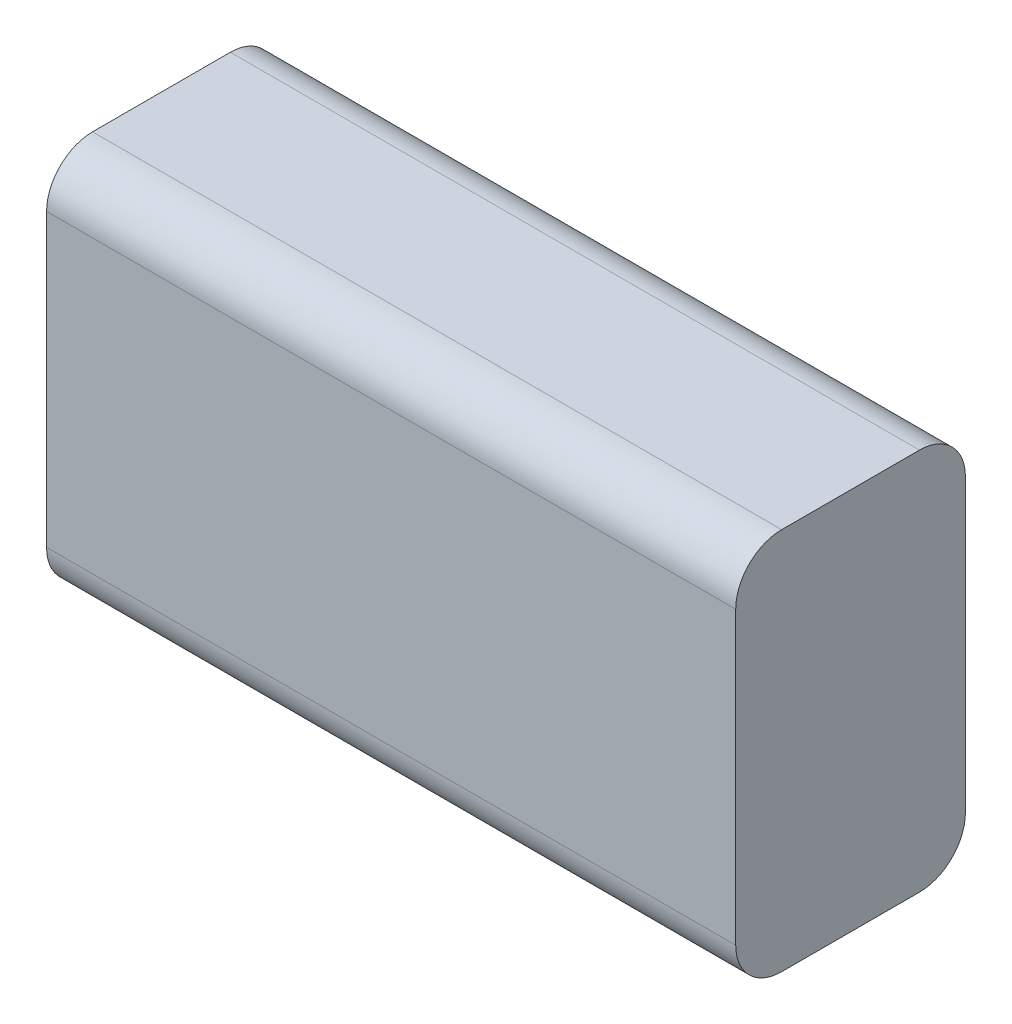
ISO-10303-21;
HEADER;
FILE_DESCRIPTION(('STEP AP214'),'2;1');
FILE_NAME('part.step','',(''),(''),'','','');
FILE_SCHEMA(('AUTOMOTIVE_DESIGN { 1 0 10303 214 1 1 1 1 }'));
ENDSEC;
DATA;
#1=APPLICATION_CONTEXT('core data for automotive mechanical design processes');
#2=APPLICATION_PROTOCOL_DEFINITION('international standard','automotive_design',2000,#1);
#3=PRODUCT_CONTEXT('',#1,'mechanical');
#4=PRODUCT('Part','Part','',(#3));
#5=PRODUCT_RELATED_PRODUCT_CATEGORY('part','',(#4));
#6=PRODUCT_DEFINITION_FORMATION('','',#4);
#7=PRODUCT_DEFINITION_CONTEXT('part definition',#1,'design');
#8=PRODUCT_DEFINITION('design','',#6,#7);
#9=PRODUCT_DEFINITION_SHAPE('','',#8);
#10=(LENGTH_UNIT() NAMED_UNIT(*) SI_UNIT(.MILLI.,.METRE.));
#11=(NAMED_UNIT(*) PLANE_ANGLE_UNIT() SI_UNIT($,.RADIAN.));
#12=(NAMED_UNIT(*) SI_UNIT($,.STERADIAN.) SOLID_ANGLE_UNIT());
#13=UNCERTAINTY_MEASURE_WITH_UNIT(LENGTH_MEASURE(1.E-05),#10,'distance_accuracy_value','');
#14=(GEOMETRIC_REPRESENTATION_CONTEXT(3) GLOBAL_UNCERTAINTY_ASSIGNED_CONTEXT((#13)) GLOBAL_UNIT_ASSIGNED_CONTEXT((#10,
#11,#12)) REPRESENTATION_CONTEXT('',''));
#15=CARTESIAN_POINT('',(0.,0.,0.));
#16=DIRECTION('',(0.,0.,1.));
#17=DIRECTION('',(1.,0.,0.));
#18=AXIS2_PLACEMENT_3D('',#15,#16,#17);
#19=CARTESIAN_POINT('',(0.,0.,15.));
#20=DIRECTION('',(1.,0.,0.));
#21=DIRECTION('',(0.,1.,0.));
#22=AXIS2_PLACEMENT_3D('',#19,#20,#21);
#23=PLANE('',#22);
#24=DIRECTION('',(0.,-1.,0.));
#25=VECTOR('',#24,1.);
#26=CARTESIAN_POINT('',(0.,0.,0.));
#27=LINE('',#26,#25);
#28=CARTESIAN_POINT('',(0.,22.,0.));
#29=VERTEX_POINT('',#28);
#30=CARTESIAN_POINT('',(0.,3.,0.));
#31=VERTEX_POINT('',#30);
#32=EDGE_CURVE('E197',#29,#31,#27,.T.);
#33=ORIENTED_EDGE('',*,*,#32,.T.);
#34=CARTESIAN_POINT('',(0.,3.,3.));
#35=DIRECTION('',(1.,0.,0.));
#36=DIRECTION('',(0.,1.,0.));
#37=AXIS2_PLACEMENT_3D('',#34,#35,#36);
#38=CIRCLE('',#37,3.);
#39=CARTESIAN_POINT('',(0.,0.,3.));
#40=VERTEX_POINT('',#39);
#41=EDGE_CURVE('E163',#31,#40,#38,.F.);
#42=ORIENTED_EDGE('',*,*,#41,.T.);
#43=DIRECTION('',(0.,0.,-1.));
#44=VECTOR('',#43,1.);
#45=CARTESIAN_POINT('',(0.,0.,15.));
#46=LINE('',#45,#44);
#47=CARTESIAN_POINT('',(0.,0.,12.));
#48=VERTEX_POINT('',#47);
#49=EDGE_CURVE('E131',#48,#40,#46,.T.);
#50=ORIENTED_EDGE('',*,*,#49,.F.);
#51=CARTESIAN_POINT('',(0.,3.,12.));
#52=DIRECTION('',(1.,0.,0.));
#53=DIRECTION('',(0.,1.,0.));
#54=AXIS2_PLACEMENT_3D('',#51,#52,#53);
#55=CIRCLE('',#54,3.);
#56=CARTESIAN_POINT('',(0.,3.,15.));
#57=VERTEX_POINT('',#56);
#58=EDGE_CURVE('E136',#48,#57,#55,.F.);
#59=ORIENTED_EDGE('',*,*,#58,.T.);
#60=DIRECTION('',(0.,-1.,0.));
#61=VECTOR('',#60,1.);
#62=CARTESIAN_POINT('',(0.,0.,15.));
#63=LINE('',#62,#61);
#64=CARTESIAN_POINT('',(0.,22.,15.));
#65=VERTEX_POINT('',#64);
#66=EDGE_CURVE('E189',#65,#57,#63,.T.);
#67=ORIENTED_EDGE('',*,*,#66,.F.);
#68=CARTESIAN_POINT('',(0.,22.,12.));
#69=DIRECTION('',(1.,0.,0.));
#70=DIRECTION('',(0.,1.,0.));
#71=AXIS2_PLACEMENT_3D('',#68,#69,#70);
#72=CIRCLE('',#71,3.);
#73=CARTESIAN_POINT('',(0.,25.,12.));
#74=VERTEX_POINT('',#73);
#75=EDGE_CURVE('E64',#65,#74,#72,.F.);
#76=ORIENTED_EDGE('',*,*,#75,.T.);
#77=DIRECTION('',(0.,0.,-1.));
#78=VECTOR('',#77,1.);
#79=CARTESIAN_POINT('',(0.,25.,15.));
#80=LINE('',#79,#78);
#81=CARTESIAN_POINT('',(0.,25.,3.));
#82=VERTEX_POINT('',#81);
#83=EDGE_CURVE('E178',#74,#82,#80,.T.);
#84=ORIENTED_EDGE('',*,*,#83,.T.);
#85=CARTESIAN_POINT('',(0.,22.,3.));
#86=DIRECTION('',(1.,0.,0.));
#87=DIRECTION('',(0.,1.,0.));
#88=AXIS2_PLACEMENT_3D('',#85,#86,#87);
#89=CIRCLE('',#88,3.);
#90=EDGE_CURVE('E57',#82,#29,#89,.F.);
#91=ORIENTED_EDGE('',*,*,#90,.T.);
#92=EDGE_LOOP('',(#33,#42,#50,#59,#67,#76,#84,#91));
#93=FACE_BOUND('',#92,.T.);
#94=ADVANCED_FACE('F41',(#93),#23,.F.);
#95=CARTESIAN_POINT('',(0.,0.,15.));
#96=DIRECTION('',(0.,1.,0.));
#97=DIRECTION('',(0.,0.,1.));
#98=AXIS2_PLACEMENT_3D('',#95,#96,#97);
#99=PLANE('',#98);
#100=ORIENTED_EDGE('',*,*,#49,.T.);
#101=DIRECTION('',(1.,0.,0.));
#102=VECTOR('',#101,1.);
#103=CARTESIAN_POINT('',(45.,0.,3.));
#104=LINE('',#103,#102);
#105=CARTESIAN_POINT('',(45.,0.,3.));
#106=VERTEX_POINT('',#105);
#107=EDGE_CURVE('E129',#40,#106,#104,.T.);
#108=ORIENTED_EDGE('',*,*,#107,.T.);
#109=DIRECTION('',(0.,0.,-1.));
#110=VECTOR('',#109,1.);
#111=CARTESIAN_POINT('',(45.,0.,15.));
#112=LINE('',#111,#110);
#113=CARTESIAN_POINT('',(45.,0.,12.));
#114=VERTEX_POINT('',#113);
#115=EDGE_CURVE('E111',#114,#106,#112,.T.);
#116=ORIENTED_EDGE('',*,*,#115,.F.);
#117=DIRECTION('',(1.,0.,0.));
#118=VECTOR('',#117,1.);
#119=CARTESIAN_POINT('',(0.,0.,12.));
#120=LINE('',#119,#118);
#121=EDGE_CURVE('E126',#114,#48,#120,.F.);
#122=ORIENTED_EDGE('',*,*,#121,.T.);
#123=EDGE_LOOP('',(#100,#108,#116,#122));
#124=FACE_BOUND('',#123,.T.);
#125=ADVANCED_FACE('F125',(#124),#99,.F.);
#126=CARTESIAN_POINT('',(45.,0.,15.));
#127=DIRECTION('',(-1.,0.,0.));
#128=DIRECTION('',(0.,-1.,0.));
#129=AXIS2_PLACEMENT_3D('',#126,#127,#128);
#130=PLANE('',#129);
#131=ORIENTED_EDGE('',*,*,#115,.T.);
#132=CARTESIAN_POINT('',(45.,3.,3.));
#133=DIRECTION('',(-1.,0.,0.));
#134=DIRECTION('',(0.,-1.,0.));
#135=AXIS2_PLACEMENT_3D('',#132,#133,#134);
#136=CIRCLE('',#135,3.);
#137=CARTESIAN_POINT('',(45.,3.,0.));
#138=VERTEX_POINT('',#137);
#139=EDGE_CURVE('E119',#106,#138,#136,.F.);
#140=ORIENTED_EDGE('',*,*,#139,.T.);
#141=DIRECTION('',(0.,1.,0.));
#142=VECTOR('',#141,1.);
#143=CARTESIAN_POINT('',(45.,0.,0.));
#144=LINE('',#143,#142);
#145=CARTESIAN_POINT('',(45.,22.,0.));
#146=VERTEX_POINT('',#145);
#147=EDGE_CURVE('E192',#138,#146,#144,.T.);
#148=ORIENTED_EDGE('',*,*,#147,.T.);
#149=CARTESIAN_POINT('',(45.,22.,3.));
#150=DIRECTION('',(-1.,0.,0.));
#151=DIRECTION('',(0.,-1.,0.));
#152=AXIS2_PLACEMENT_3D('',#149,#150,#151);
#153=CIRCLE('',#152,3.);
#154=CARTESIAN_POINT('',(45.,25.,3.));
#155=VERTEX_POINT('',#154);
#156=EDGE_CURVE('E120',#146,#155,#153,.F.);
#157=ORIENTED_EDGE('',*,*,#156,.T.);
#158=DIRECTION('',(0.,0.,-1.));
#159=VECTOR('',#158,1.);
#160=CARTESIAN_POINT('',(45.,25.,15.));
#161=LINE('',#160,#159);
#162=CARTESIAN_POINT('',(45.,25.,12.));
#163=VERTEX_POINT('',#162);
#164=EDGE_CURVE('E132',#163,#155,#161,.T.);
#165=ORIENTED_EDGE('',*,*,#164,.F.);
#166=CARTESIAN_POINT('',(45.,22.,12.));
#167=DIRECTION('',(-1.,0.,0.));
#168=DIRECTION('',(0.,-1.,0.));
#169=AXIS2_PLACEMENT_3D('',#166,#167,#168);
#170=CIRCLE('',#169,3.);
#171=CARTESIAN_POINT('',(45.,22.,15.));
#172=VERTEX_POINT('',#171);
#173=EDGE_CURVE('E141',#163,#172,#170,.F.);
#174=ORIENTED_EDGE('',*,*,#173,.T.);
#175=DIRECTION('',(0.,1.,0.));
#176=VECTOR('',#175,1.);
#177=CARTESIAN_POINT('',(45.,0.,15.));
#178=LINE('',#177,#176);
#179=CARTESIAN_POINT('',(45.,3.,15.));
#180=VERTEX_POINT('',#179);
#181=EDGE_CURVE('E113',#180,#172,#178,.T.);
#182=ORIENTED_EDGE('',*,*,#181,.F.);
#183=CARTESIAN_POINT('',(45.,3.,12.));
#184=DIRECTION('',(-1.,0.,0.));
#185=DIRECTION('',(0.,-1.,0.));
#186=AXIS2_PLACEMENT_3D('',#183,#184,#185);
#187=CIRCLE('',#186,3.);
#188=EDGE_CURVE('E108',#180,#114,#187,.F.);
#189=ORIENTED_EDGE('',*,*,#188,.T.);
#190=EDGE_LOOP('',(#131,#140,#148,#157,#165,#174,#182,#189));
#191=FACE_BOUND('',#190,.T.);
#192=ADVANCED_FACE('F110',(#191),#130,.F.);
#193=CARTESIAN_POINT('',(0.,25.,15.));
#194=DIRECTION('',(0.,-1.,0.));
#195=DIRECTION('',(0.,0.,-1.));
#196=AXIS2_PLACEMENT_3D('',#193,#194,#195);
#197=PLANE('',#196);
#198=ORIENTED_EDGE('',*,*,#164,.T.);
#199=DIRECTION('',(-1.,0.,0.));
#200=VECTOR('',#199,1.);
#201=CARTESIAN_POINT('',(0.,25.,3.));
#202=LINE('',#201,#200);
#203=EDGE_CURVE('E11',#155,#82,#202,.T.);
#204=ORIENTED_EDGE('',*,*,#203,.T.);
#205=ORIENTED_EDGE('',*,*,#83,.F.);
#206=DIRECTION('',(-1.,0.,0.));
#207=VECTOR('',#206,1.);
#208=CARTESIAN_POINT('',(0.,25.,12.));
#209=LINE('',#208,#207);
#210=EDGE_CURVE('E50',#74,#163,#209,.F.);
#211=ORIENTED_EDGE('',*,*,#210,.T.);
#212=EDGE_LOOP('',(#198,#204,#205,#211));
#213=FACE_BOUND('',#212,.T.);
#214=ADVANCED_FACE('F177',(#213),#197,.F.);
#215=CARTESIAN_POINT('',(0.,0.,15.));
#216=DIRECTION('',(0.,0.,-1.));
#217=DIRECTION('',(-1.,0.,0.));
#218=AXIS2_PLACEMENT_3D('',#215,#216,#217);
#219=PLANE('',#218);
#220=ORIENTED_EDGE('',*,*,#66,.T.);
#221=DIRECTION('',(1.,0.,0.));
#222=VECTOR('',#221,1.);
#223=CARTESIAN_POINT('',(0.,3.,15.));
#224=LINE('',#223,#222);
#225=EDGE_CURVE('E170',#57,#180,#224,.T.);
#226=ORIENTED_EDGE('',*,*,#225,.T.);
#227=ORIENTED_EDGE('',*,*,#181,.T.);
#228=DIRECTION('',(-1.,0.,0.));
#229=VECTOR('',#228,1.);
#230=CARTESIAN_POINT('',(0.,22.,15.));
#231=LINE('',#230,#229);
#232=EDGE_CURVE('E166',#172,#65,#231,.T.);
#233=ORIENTED_EDGE('',*,*,#232,.T.);
#234=EDGE_LOOP('',(#220,#226,#227,#233));
#235=FACE_BOUND('',#234,.T.);
#236=ADVANCED_FACE('F188',(#235),#219,.F.);
#237=CARTESIAN_POINT('',(0.,0.,0.));
#238=DIRECTION('',(0.,0.,-1.));
#239=DIRECTION('',(-1.,0.,0.));
#240=AXIS2_PLACEMENT_3D('',#237,#238,#239);
#241=PLANE('',#240);
#242=ORIENTED_EDGE('',*,*,#147,.F.);
#243=DIRECTION('',(1.,0.,0.));
#244=VECTOR('',#243,1.);
#245=CARTESIAN_POINT('',(0.,3.,0.));
#246=LINE('',#245,#244);
#247=EDGE_CURVE('E154',#138,#31,#246,.F.);
#248=ORIENTED_EDGE('',*,*,#247,.T.);
#249=ORIENTED_EDGE('',*,*,#32,.F.);
#250=DIRECTION('',(-1.,0.,0.));
#251=VECTOR('',#250,1.);
#252=CARTESIAN_POINT('',(45.,22.,0.));
#253=LINE('',#252,#251);
#254=EDGE_CURVE('E151',#29,#146,#253,.F.);
#255=ORIENTED_EDGE('',*,*,#254,.T.);
#256=EDGE_LOOP('',(#242,#248,#249,#255));
#257=FACE_BOUND('',#256,.T.);
#258=ADVANCED_FACE('F207',(#257),#241,.T.);
#259=CARTESIAN_POINT('',(0.,3.,3.));
#260=DIRECTION('',(-1.,0.,0.));
#261=DIRECTION('',(0.,0.,1.));
#262=AXIS2_PLACEMENT_3D('',#259,#260,#261);
#263=CYLINDRICAL_SURFACE('',#262,3.);
#264=ORIENTED_EDGE('',*,*,#41,.F.);
#265=ORIENTED_EDGE('',*,*,#247,.F.);
#266=ORIENTED_EDGE('',*,*,#139,.F.);
#267=ORIENTED_EDGE('',*,*,#107,.F.);
#268=EDGE_LOOP('',(#264,#265,#266,#267));
#269=FACE_BOUND('',#268,.T.);
#270=ADVANCED_FACE('F215',(#269),#263,.T.);
#271=CARTESIAN_POINT('',(0.,3.,12.));
#272=DIRECTION('',(1.,0.,0.));
#273=DIRECTION('',(0.,0.,-1.));
#274=AXIS2_PLACEMENT_3D('',#271,#272,#273);
#275=CYLINDRICAL_SURFACE('',#274,3.);
#276=ORIENTED_EDGE('',*,*,#58,.F.);
#277=ORIENTED_EDGE('',*,*,#121,.F.);
#278=ORIENTED_EDGE('',*,*,#188,.F.);
#279=ORIENTED_EDGE('',*,*,#225,.F.);
#280=EDGE_LOOP('',(#276,#277,#278,#279));
#281=FACE_BOUND('',#280,.T.);
#282=ADVANCED_FACE('F135',(#281),#275,.T.);
#283=CARTESIAN_POINT('',(0.,22.,3.));
#284=DIRECTION('',(1.,0.,0.));
#285=DIRECTION('',(0.,0.,-1.));
#286=AXIS2_PLACEMENT_3D('',#283,#284,#285);
#287=CYLINDRICAL_SURFACE('',#286,3.);
#288=ORIENTED_EDGE('',*,*,#156,.F.);
#289=ORIENTED_EDGE('',*,*,#254,.F.);
#290=ORIENTED_EDGE('',*,*,#90,.F.);
#291=ORIENTED_EDGE('',*,*,#203,.F.);
#292=EDGE_LOOP('',(#288,#289,#290,#291));
#293=FACE_BOUND('',#292,.T.);
#294=ADVANCED_FACE('F209',(#293),#287,.T.);
#295=CARTESIAN_POINT('',(0.,22.,12.));
#296=DIRECTION('',(-1.,0.,0.));
#297=DIRECTION('',(0.,0.,1.));
#298=AXIS2_PLACEMENT_3D('',#295,#296,#297);
#299=CYLINDRICAL_SURFACE('',#298,3.);
#300=ORIENTED_EDGE('',*,*,#173,.F.);
#301=ORIENTED_EDGE('',*,*,#210,.F.);
#302=ORIENTED_EDGE('',*,*,#75,.F.);
#303=ORIENTED_EDGE('',*,*,#232,.F.);
#304=EDGE_LOOP('',(#300,#301,#302,#303));
#305=FACE_BOUND('',#304,.T.);
#306=ADVANCED_FACE('F43',(#305),#299,.T.);
#307=CLOSED_SHELL('',(#94,#125,#192,#214,#236,#258,#270,#282,#294,#306));
#308=MANIFOLD_SOLID_BREP('B2',#307);
#309=ADVANCED_BREP_SHAPE_REPRESENTATION('',(#18,#308),#14);
#310=SHAPE_DEFINITION_REPRESENTATION(#9,#309);
ENDSEC;
END-ISO-10303-21;
